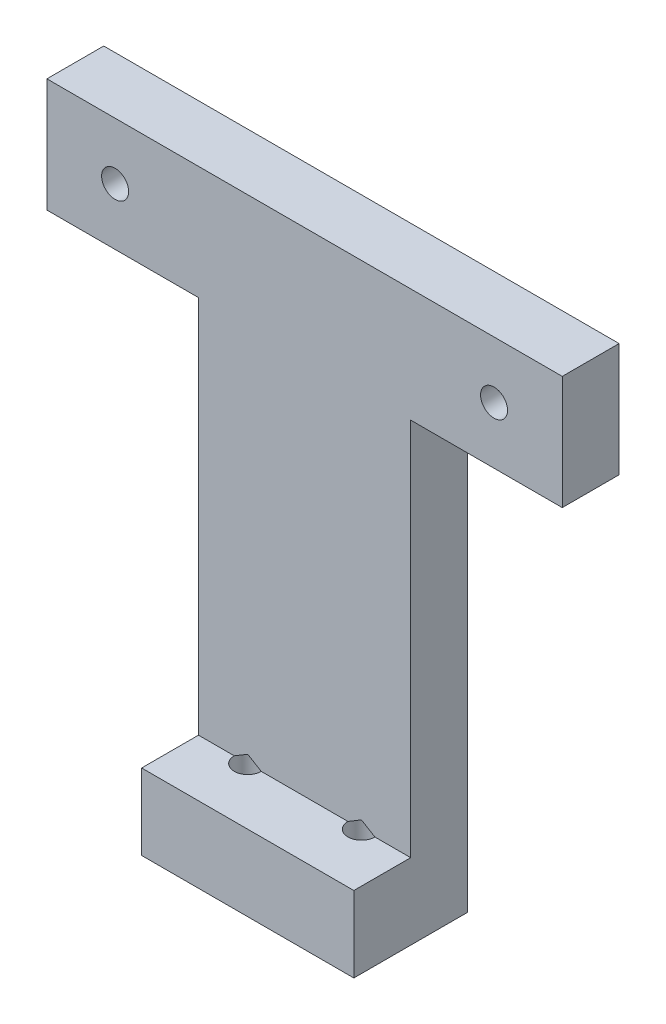
ISO-10303-21;
HEADER;
FILE_DESCRIPTION(('STEP AP214'),'2;1');
FILE_NAME('part.step','',(''),(''),'','','');
FILE_SCHEMA(('AUTOMOTIVE_DESIGN { 1 0 10303 214 1 1 1 1 }'));
ENDSEC;
DATA;
#1=APPLICATION_CONTEXT('core data for automotive mechanical design processes');
#2=APPLICATION_PROTOCOL_DEFINITION('international standard','automotive_design',2000,#1);
#3=PRODUCT_CONTEXT('',#1,'mechanical');
#4=PRODUCT('Part','Part','',(#3));
#5=PRODUCT_RELATED_PRODUCT_CATEGORY('part','',(#4));
#6=PRODUCT_DEFINITION_FORMATION('','',#4);
#7=PRODUCT_DEFINITION_CONTEXT('part definition',#1,'design');
#8=PRODUCT_DEFINITION('design','',#6,#7);
#9=PRODUCT_DEFINITION_SHAPE('','',#8);
#10=(LENGTH_UNIT() NAMED_UNIT(*) SI_UNIT(.MILLI.,.METRE.));
#11=(NAMED_UNIT(*) PLANE_ANGLE_UNIT() SI_UNIT($,.RADIAN.));
#12=(NAMED_UNIT(*) SI_UNIT($,.STERADIAN.) SOLID_ANGLE_UNIT());
#13=UNCERTAINTY_MEASURE_WITH_UNIT(LENGTH_MEASURE(1.E-05),#10,'distance_accuracy_value','');
#14=(GEOMETRIC_REPRESENTATION_CONTEXT(3) GLOBAL_UNCERTAINTY_ASSIGNED_CONTEXT((#13)) GLOBAL_UNIT_ASSIGNED_CONTEXT((#10,
#11,#12)) REPRESENTATION_CONTEXT('',''));
#15=CARTESIAN_POINT('',(0.,0.,0.));
#16=DIRECTION('',(0.,0.,1.));
#17=DIRECTION('',(1.,0.,0.));
#18=AXIS2_PLACEMENT_3D('',#15,#16,#17);
#19=CARTESIAN_POINT('',(-8.88999999999999,47.625,4.7625));
#20=DIRECTION('',(1.,0.,0.));
#21=DIRECTION('',(0.,0.,-1.));
#22=AXIS2_PLACEMENT_3D('',#19,#20,#21);
#23=PLANE('',#22);
#24=DIRECTION('',(0.,0.,1.));
#25=VECTOR('',#24,1.);
#26=CARTESIAN_POINT('',(-8.88999999999999,38.1,-4.7625));
#27=LINE('',#26,#25);
#28=CARTESIAN_POINT('',(-8.88999999999999,38.1,-4.7625));
#29=VERTEX_POINT('',#28);
#30=CARTESIAN_POINT('',(-8.88999999999999,38.1,0.));
#31=VERTEX_POINT('',#30);
#32=EDGE_CURVE('E72',#29,#31,#27,.T.);
#33=ORIENTED_EDGE('',*,*,#32,.F.);
#34=DIRECTION('',(0.,-1.,0.));
#35=VECTOR('',#34,1.);
#36=CARTESIAN_POINT('',(-8.88999999999999,47.625,-4.7625));
#37=LINE('',#36,#35);
#38=CARTESIAN_POINT('',(-8.88999999999999,0.,-4.7625));
#39=VERTEX_POINT('',#38);
#40=EDGE_CURVE('E243',#29,#39,#37,.T.);
#41=ORIENTED_EDGE('',*,*,#40,.T.);
#42=DIRECTION('',(0.,0.,1.));
#43=VECTOR('',#42,1.);
#44=CARTESIAN_POINT('',(-8.88999999999999,0.,4.7625));
#45=LINE('',#44,#43);
#46=CARTESIAN_POINT('',(-8.88999999999999,0.,4.7625));
#47=VERTEX_POINT('',#46);
#48=EDGE_CURVE('E235',#39,#47,#45,.T.);
#49=ORIENTED_EDGE('',*,*,#48,.T.);
#50=DIRECTION('',(0.,-1.,0.));
#51=VECTOR('',#50,1.);
#52=CARTESIAN_POINT('',(-8.88999999999999,47.625,4.7625));
#53=LINE('',#52,#51);
#54=CARTESIAN_POINT('',(-8.88999999999999,6.35,4.7625));
#55=VERTEX_POINT('',#54);
#56=EDGE_CURVE('E241',#55,#47,#53,.T.);
#57=ORIENTED_EDGE('',*,*,#56,.F.);
#58=DIRECTION('',(0.,0.,1.));
#59=VECTOR('',#58,1.);
#60=CARTESIAN_POINT('',(-8.88999999999999,6.35,4.7625));
#61=LINE('',#60,#59);
#62=CARTESIAN_POINT('',(-8.88999999999999,6.35,0.));
#63=VERTEX_POINT('',#62);
#64=EDGE_CURVE('E216',#63,#55,#61,.T.);
#65=ORIENTED_EDGE('',*,*,#64,.F.);
#66=DIRECTION('',(0.,1.,0.));
#67=VECTOR('',#66,1.);
#68=CARTESIAN_POINT('',(-8.88999999999999,-18.4067869616074,0.));
#69=LINE('',#68,#67);
#70=EDGE_CURVE('E219',#63,#31,#69,.T.);
#71=ORIENTED_EDGE('',*,*,#70,.T.);
#72=EDGE_LOOP('',(#33,#41,#49,#57,#65,#71));
#73=FACE_BOUND('',#72,.T.);
#74=ADVANCED_FACE('F49',(#73),#23,.F.);
#75=CARTESIAN_POINT('',(8.89000000000001,47.625,4.7625));
#76=DIRECTION('',(-1.,0.,0.));
#77=DIRECTION('',(0.,0.,1.));
#78=AXIS2_PLACEMENT_3D('',#75,#76,#77);
#79=PLANE('',#78);
#80=DIRECTION('',(0.,-1.,0.));
#81=VECTOR('',#80,1.);
#82=CARTESIAN_POINT('',(8.89000000000001,47.625,-4.7625));
#83=LINE('',#82,#81);
#84=CARTESIAN_POINT('',(8.88999999999999,38.1,-4.7625));
#85=VERTEX_POINT('',#84);
#86=CARTESIAN_POINT('',(8.89000000000001,0.,-4.7625));
#87=VERTEX_POINT('',#86);
#88=EDGE_CURVE('E245',#85,#87,#83,.T.);
#89=ORIENTED_EDGE('',*,*,#88,.F.);
#90=DIRECTION('',(0.,0.,1.));
#91=VECTOR('',#90,1.);
#92=CARTESIAN_POINT('',(8.88999999999999,38.1,-4.7625));
#93=LINE('',#92,#91);
#94=CARTESIAN_POINT('',(8.89000000000001,38.1,0.));
#95=VERTEX_POINT('',#94);
#96=EDGE_CURVE('E168',#85,#95,#93,.T.);
#97=ORIENTED_EDGE('',*,*,#96,.T.);
#98=DIRECTION('',(0.,1.,0.));
#99=VECTOR('',#98,1.);
#100=CARTESIAN_POINT('',(8.89000000000001,-18.4067869616074,0.));
#101=LINE('',#100,#99);
#102=CARTESIAN_POINT('',(8.89000000000001,6.35,0.));
#103=VERTEX_POINT('',#102);
#104=EDGE_CURVE('E227',#103,#95,#101,.T.);
#105=ORIENTED_EDGE('',*,*,#104,.F.);
#106=DIRECTION('',(0.,0.,-1.));
#107=VECTOR('',#106,1.);
#108=CARTESIAN_POINT('',(8.89000000000001,6.35,4.7625));
#109=LINE('',#108,#107);
#110=CARTESIAN_POINT('',(8.89000000000001,6.34999999999999,4.7625));
#111=VERTEX_POINT('',#110);
#112=EDGE_CURVE('E215',#111,#103,#109,.T.);
#113=ORIENTED_EDGE('',*,*,#112,.F.);
#114=DIRECTION('',(0.,-1.,0.));
#115=VECTOR('',#114,1.);
#116=CARTESIAN_POINT('',(8.89000000000001,47.625,4.7625));
#117=LINE('',#116,#115);
#118=CARTESIAN_POINT('',(8.89000000000001,0.,4.7625));
#119=VERTEX_POINT('',#118);
#120=EDGE_CURVE('E158',#111,#119,#117,.T.);
#121=ORIENTED_EDGE('',*,*,#120,.T.);
#122=DIRECTION('',(0.,0.,-1.));
#123=VECTOR('',#122,1.);
#124=CARTESIAN_POINT('',(8.89000000000001,0.,4.7625));
#125=LINE('',#124,#123);
#126=EDGE_CURVE('E218',#119,#87,#125,.T.);
#127=ORIENTED_EDGE('',*,*,#126,.T.);
#128=EDGE_LOOP('',(#89,#97,#105,#113,#121,#127));
#129=FACE_BOUND('',#128,.T.);
#130=ADVANCED_FACE('F51',(#129),#79,.F.);
#131=CARTESIAN_POINT('',(-8.88999999999999,47.625,-4.7625));
#132=DIRECTION('',(0.,0.,1.));
#133=DIRECTION('',(1.,0.,0.));
#134=AXIS2_PLACEMENT_3D('',#131,#132,#133);
#135=PLANE('',#134);
#136=CARTESIAN_POINT('',(-15.875,42.8625,-4.7625));
#137=DIRECTION('',(0.,0.,1.));
#138=DIRECTION('',(1.,0.,0.));
#139=AXIS2_PLACEMENT_3D('',#136,#137,#138);
#140=CIRCLE('',#139,1.1303);
#141=CARTESIAN_POINT('',(-14.7447,42.8625,-4.7625));
#142=VERTEX_POINT('',#141);
#143=EDGE_CURVE('E180',#142,#142,#140,.T.);
#144=ORIENTED_EDGE('',*,*,#143,.T.);
#145=EDGE_LOOP('',(#144));
#146=FACE_BOUND('',#145,.T.);
#147=CARTESIAN_POINT('',(15.875,42.8625,-4.7625));
#148=DIRECTION('',(0.,0.,1.));
#149=DIRECTION('',(1.,0.,0.));
#150=AXIS2_PLACEMENT_3D('',#147,#148,#149);
#151=CIRCLE('',#150,1.1303);
#152=CARTESIAN_POINT('',(17.0053,42.8625,-4.7625));
#153=VERTEX_POINT('',#152);
#154=EDGE_CURVE('E324',#153,#153,#151,.T.);
#155=ORIENTED_EDGE('',*,*,#154,.T.);
#156=EDGE_LOOP('',(#155));
#157=FACE_BOUND('',#156,.T.);
#158=DIRECTION('',(-1.,0.,0.));
#159=VECTOR('',#158,1.);
#160=CARTESIAN_POINT('',(-8.88999999999999,0.,-4.7625));
#161=LINE('',#160,#159);
#162=EDGE_CURVE('E233',#87,#39,#161,.T.);
#163=ORIENTED_EDGE('',*,*,#162,.T.);
#164=ORIENTED_EDGE('',*,*,#40,.F.);
#165=DIRECTION('',(1.,0.,0.));
#166=VECTOR('',#165,1.);
#167=CARTESIAN_POINT('',(-21.59,38.1,-4.7625));
#168=LINE('',#167,#166);
#169=CARTESIAN_POINT('',(-21.59,38.1,-4.7625));
#170=VERTEX_POINT('',#169);
#171=EDGE_CURVE('E195',#170,#29,#168,.T.);
#172=ORIENTED_EDGE('',*,*,#171,.F.);
#173=DIRECTION('',(0.,-1.,0.));
#174=VECTOR('',#173,1.);
#175=CARTESIAN_POINT('',(-21.59,47.625,-4.7625));
#176=LINE('',#175,#174);
#177=CARTESIAN_POINT('',(-21.59,47.625,-4.7625));
#178=VERTEX_POINT('',#177);
#179=EDGE_CURVE('E153',#178,#170,#176,.T.);
#180=ORIENTED_EDGE('',*,*,#179,.F.);
#181=DIRECTION('',(-1.,0.,0.));
#182=VECTOR('',#181,1.);
#183=CARTESIAN_POINT('',(-8.88999999999999,47.625,-4.7625));
#184=LINE('',#183,#182);
#185=CARTESIAN_POINT('',(21.59,47.625,-4.7625));
#186=VERTEX_POINT('',#185);
#187=EDGE_CURVE('E145',#186,#178,#184,.T.);
#188=ORIENTED_EDGE('',*,*,#187,.F.);
#189=DIRECTION('',(0.,-1.,0.));
#190=VECTOR('',#189,1.);
#191=CARTESIAN_POINT('',(21.59,47.625,-4.7625));
#192=LINE('',#191,#190);
#193=CARTESIAN_POINT('',(21.59,38.1,-4.7625));
#194=VERTEX_POINT('',#193);
#195=EDGE_CURVE('E149',#186,#194,#192,.T.);
#196=ORIENTED_EDGE('',*,*,#195,.T.);
#197=DIRECTION('',(-1.,0.,0.));
#198=VECTOR('',#197,1.);
#199=CARTESIAN_POINT('',(21.59,38.1,-4.7625));
#200=LINE('',#199,#198);
#201=EDGE_CURVE('E178',#194,#85,#200,.T.);
#202=ORIENTED_EDGE('',*,*,#201,.T.);
#203=ORIENTED_EDGE('',*,*,#88,.T.);
#204=EDGE_LOOP('',(#163,#164,#172,#180,#188,#196,#202,#203));
#205=FACE_BOUND('',#204,.T.);
#206=ADVANCED_FACE('F148',(#146,#157,#205),#135,.F.);
#207=CARTESIAN_POINT('',(-8.88999999999999,47.625,4.7625));
#208=DIRECTION('',(0.,0.,-1.));
#209=DIRECTION('',(-1.,0.,0.));
#210=AXIS2_PLACEMENT_3D('',#207,#208,#209);
#211=PLANE('',#210);
#212=ORIENTED_EDGE('',*,*,#120,.F.);
#213=DIRECTION('',(1.,0.,0.));
#214=VECTOR('',#213,1.);
#215=CARTESIAN_POINT('',(-8.88999999999999,6.35,4.7625));
#216=LINE('',#215,#214);
#217=EDGE_CURVE('E213',#55,#111,#216,.T.);
#218=ORIENTED_EDGE('',*,*,#217,.F.);
#219=ORIENTED_EDGE('',*,*,#56,.T.);
#220=DIRECTION('',(1.,0.,0.));
#221=VECTOR('',#220,1.);
#222=CARTESIAN_POINT('',(-8.88999999999999,0.,4.7625));
#223=LINE('',#222,#221);
#224=EDGE_CURVE('E159',#47,#119,#223,.T.);
#225=ORIENTED_EDGE('',*,*,#224,.T.);
#226=EDGE_LOOP('',(#212,#218,#219,#225));
#227=FACE_BOUND('',#226,.T.);
#228=ADVANCED_FACE('F280',(#227),#211,.F.);
#229=CARTESIAN_POINT('',(0.,47.625,0.));
#230=DIRECTION('',(0.,-1.,0.));
#231=DIRECTION('',(0.,0.,-1.));
#232=AXIS2_PLACEMENT_3D('',#229,#230,#231);
#233=PLANE('',#232);
#234=ORIENTED_EDGE('',*,*,#187,.T.);
#235=DIRECTION('',(0.,0.,-1.));
#236=VECTOR('',#235,1.);
#237=CARTESIAN_POINT('',(-21.59,47.625,-4.7625));
#238=LINE('',#237,#236);
#239=CARTESIAN_POINT('',(-21.59,47.625,0.));
#240=VERTEX_POINT('',#239);
#241=EDGE_CURVE('E189',#240,#178,#238,.T.);
#242=ORIENTED_EDGE('',*,*,#241,.F.);
#243=DIRECTION('',(-1.,0.,0.));
#244=VECTOR('',#243,1.);
#245=CARTESIAN_POINT('',(-8.88999999999999,47.625,0.));
#246=LINE('',#245,#244);
#247=CARTESIAN_POINT('',(21.59,47.625,0.));
#248=VERTEX_POINT('',#247);
#249=EDGE_CURVE('E171',#248,#240,#246,.T.);
#250=ORIENTED_EDGE('',*,*,#249,.F.);
#251=DIRECTION('',(0.,0.,-1.));
#252=VECTOR('',#251,1.);
#253=CARTESIAN_POINT('',(21.59,47.625,-4.7625));
#254=LINE('',#253,#252);
#255=EDGE_CURVE('E165',#248,#186,#254,.T.);
#256=ORIENTED_EDGE('',*,*,#255,.T.);
#257=EDGE_LOOP('',(#234,#242,#250,#256));
#258=FACE_BOUND('',#257,.T.);
#259=ADVANCED_FACE('F170',(#258),#233,.F.);
#260=CARTESIAN_POINT('',(0.,0.,0.));
#261=DIRECTION('',(0.,-1.,0.));
#262=DIRECTION('',(0.,0.,-1.));
#263=AXIS2_PLACEMENT_3D('',#260,#261,#262);
#264=PLANE('',#263);
#265=CARTESIAN_POINT('',(4.7625,0.,0.));
#266=DIRECTION('',(0.,-1.,0.));
#267=DIRECTION('',(0.,0.,-1.));
#268=AXIS2_PLACEMENT_3D('',#265,#266,#267);
#269=CIRCLE('',#268,1.13029999999999);
#270=CARTESIAN_POINT('',(4.7625,0.,-1.13029999999999));
#271=VERTEX_POINT('',#270);
#272=EDGE_CURVE('E198',#271,#271,#269,.T.);
#273=ORIENTED_EDGE('',*,*,#272,.F.);
#274=EDGE_LOOP('',(#273));
#275=FACE_BOUND('',#274,.T.);
#276=CARTESIAN_POINT('',(-4.7625,0.,0.));
#277=DIRECTION('',(0.,-1.,0.));
#278=DIRECTION('',(0.,0.,-1.));
#279=AXIS2_PLACEMENT_3D('',#276,#277,#278);
#280=CIRCLE('',#279,1.13029999999999);
#281=CARTESIAN_POINT('',(-4.7625,0.,-1.13029999999999));
#282=VERTEX_POINT('',#281);
#283=EDGE_CURVE('E205',#282,#282,#280,.T.);
#284=ORIENTED_EDGE('',*,*,#283,.F.);
#285=EDGE_LOOP('',(#284));
#286=FACE_BOUND('',#285,.T.);
#287=ORIENTED_EDGE('',*,*,#126,.F.);
#288=ORIENTED_EDGE('',*,*,#224,.F.);
#289=ORIENTED_EDGE('',*,*,#48,.F.);
#290=ORIENTED_EDGE('',*,*,#162,.F.);
#291=EDGE_LOOP('',(#287,#288,#289,#290));
#292=FACE_BOUND('',#291,.T.);
#293=ADVANCED_FACE('F276',(#275,#286,#292),#264,.T.);
#294=CARTESIAN_POINT('',(0.,6.35,0.));
#295=DIRECTION('',(0.,-1.,0.));
#296=DIRECTION('',(0.,0.,-1.));
#297=AXIS2_PLACEMENT_3D('',#294,#295,#296);
#298=PLANE('',#297);
#299=DIRECTION('',(-1.,0.,0.));
#300=VECTOR('',#299,1.);
#301=CARTESIAN_POINT('',(-8.88999999999999,6.35,0.));
#302=LINE('',#301,#300);
#303=CARTESIAN_POINT('',(5.8928,6.35,0.));
#304=VERTEX_POINT('',#303);
#305=EDGE_CURVE('E220',#103,#304,#302,.T.);
#306=ORIENTED_EDGE('',*,*,#305,.T.);
#307=CARTESIAN_POINT('',(4.7625,6.35,0.));
#308=DIRECTION('',(0.,-1.,0.));
#309=DIRECTION('',(0.,0.,-1.));
#310=AXIS2_PLACEMENT_3D('',#307,#308,#309);
#311=CIRCLE('',#310,1.1303);
#312=CARTESIAN_POINT('',(3.6322,6.35,0.));
#313=VERTEX_POINT('',#312);
#314=EDGE_CURVE('E202',#304,#313,#311,.T.);
#315=ORIENTED_EDGE('',*,*,#314,.T.);
#316=CARTESIAN_POINT('',(-3.6322,6.35,0.));
#317=VERTEX_POINT('',#316);
#318=EDGE_CURVE('E223',#313,#317,#302,.T.);
#319=ORIENTED_EDGE('',*,*,#318,.T.);
#320=CARTESIAN_POINT('',(-4.7625,6.35,0.));
#321=DIRECTION('',(0.,-1.,0.));
#322=DIRECTION('',(0.,0.,-1.));
#323=AXIS2_PLACEMENT_3D('',#320,#321,#322);
#324=CIRCLE('',#323,1.1303);
#325=CARTESIAN_POINT('',(-5.8928,6.35,0.));
#326=VERTEX_POINT('',#325);
#327=EDGE_CURVE('E209',#317,#326,#324,.T.);
#328=ORIENTED_EDGE('',*,*,#327,.T.);
#329=EDGE_CURVE('E224',#326,#63,#302,.T.);
#330=ORIENTED_EDGE('',*,*,#329,.T.);
#331=ORIENTED_EDGE('',*,*,#64,.T.);
#332=ORIENTED_EDGE('',*,*,#217,.T.);
#333=ORIENTED_EDGE('',*,*,#112,.T.);
#334=EDGE_LOOP('',(#306,#315,#319,#328,#330,#331,#332,#333));
#335=FACE_BOUND('',#334,.T.);
#336=ADVANCED_FACE('F264',(#335),#298,.F.);
#337=CARTESIAN_POINT('',(-8.88999999999999,-18.4067869616074,0.));
#338=DIRECTION('',(0.,0.,-1.));
#339=DIRECTION('',(-1.,0.,0.));
#340=AXIS2_PLACEMENT_3D('',#337,#338,#339);
#341=PLANE('',#340);
#342=CARTESIAN_POINT('',(-15.875,42.8625,0.));
#343=DIRECTION('',(0.,0.,1.));
#344=DIRECTION('',(1.,0.,0.));
#345=AXIS2_PLACEMENT_3D('',#342,#343,#344);
#346=CIRCLE('',#345,1.1303);
#347=CARTESIAN_POINT('',(-14.7447,42.8625,0.));
#348=VERTEX_POINT('',#347);
#349=EDGE_CURVE('E328',#348,#348,#346,.T.);
#350=ORIENTED_EDGE('',*,*,#349,.F.);
#351=EDGE_LOOP('',(#350));
#352=FACE_BOUND('',#351,.T.);
#353=CARTESIAN_POINT('',(15.875,42.8625,0.));
#354=DIRECTION('',(0.,0.,1.));
#355=DIRECTION('',(1.,0.,0.));
#356=AXIS2_PLACEMENT_3D('',#353,#354,#355);
#357=CIRCLE('',#356,1.1303);
#358=CARTESIAN_POINT('',(17.0053,42.8625,0.));
#359=VERTEX_POINT('',#358);
#360=EDGE_CURVE('E326',#359,#359,#357,.T.);
#361=ORIENTED_EDGE('',*,*,#360,.F.);
#362=EDGE_LOOP('',(#361));
#363=FACE_BOUND('',#362,.T.);
#364=DIRECTION('',(0.857167300702112,0.515038074910055,0.));
#365=VECTOR('',#364,1.);
#366=CARTESIAN_POINT('',(4.7625,7.02915275768685,0.));
#367=LINE('',#366,#365);
#368=CARTESIAN_POINT('',(4.7625,7.02915275768685,0.));
#369=VERTEX_POINT('',#368);
#370=EDGE_CURVE('E57',#313,#369,#367,.T.);
#371=ORIENTED_EDGE('',*,*,#370,.T.);
#372=DIRECTION('',(0.857167300702112,-0.515038074910055,0.));
#373=VECTOR('',#372,1.);
#374=CARTESIAN_POINT('',(4.7625,7.02915275768685,0.));
#375=LINE('',#374,#373);
#376=EDGE_CURVE('E12',#369,#304,#375,.T.);
#377=ORIENTED_EDGE('',*,*,#376,.T.);
#378=ORIENTED_EDGE('',*,*,#305,.F.);
#379=ORIENTED_EDGE('',*,*,#104,.T.);
#380=DIRECTION('',(-1.,0.,0.));
#381=VECTOR('',#380,1.);
#382=CARTESIAN_POINT('',(21.59,38.1,0.));
#383=LINE('',#382,#381);
#384=CARTESIAN_POINT('',(21.59,38.1,0.));
#385=VERTEX_POINT('',#384);
#386=EDGE_CURVE('E64',#385,#95,#383,.T.);
#387=ORIENTED_EDGE('',*,*,#386,.F.);
#388=DIRECTION('',(0.,1.,0.));
#389=VECTOR('',#388,1.);
#390=CARTESIAN_POINT('',(21.59,47.625,0.));
#391=LINE('',#390,#389);
#392=EDGE_CURVE('E172',#385,#248,#391,.T.);
#393=ORIENTED_EDGE('',*,*,#392,.T.);
#394=ORIENTED_EDGE('',*,*,#249,.T.);
#395=DIRECTION('',(0.,1.,0.));
#396=VECTOR('',#395,1.);
#397=CARTESIAN_POINT('',(-21.59,47.625,0.));
#398=LINE('',#397,#396);
#399=CARTESIAN_POINT('',(-21.59,38.1,0.));
#400=VERTEX_POINT('',#399);
#401=EDGE_CURVE('E186',#400,#240,#398,.T.);
#402=ORIENTED_EDGE('',*,*,#401,.F.);
#403=DIRECTION('',(1.,0.,0.));
#404=VECTOR('',#403,1.);
#405=CARTESIAN_POINT('',(-21.59,38.1,0.));
#406=LINE('',#405,#404);
#407=EDGE_CURVE('E191',#400,#31,#406,.T.);
#408=ORIENTED_EDGE('',*,*,#407,.T.);
#409=ORIENTED_EDGE('',*,*,#70,.F.);
#410=ORIENTED_EDGE('',*,*,#329,.F.);
#411=DIRECTION('',(0.857167300702112,0.515038074910055,0.));
#412=VECTOR('',#411,1.);
#413=CARTESIAN_POINT('',(-4.7625,7.02915275768685,0.));
#414=LINE('',#413,#412);
#415=CARTESIAN_POINT('',(-4.7625,7.02915275768685,0.));
#416=VERTEX_POINT('',#415);
#417=EDGE_CURVE('E247',#326,#416,#414,.T.);
#418=ORIENTED_EDGE('',*,*,#417,.T.);
#419=DIRECTION('',(0.857167300702112,-0.515038074910055,0.));
#420=VECTOR('',#419,1.);
#421=CARTESIAN_POINT('',(-4.7625,7.02915275768685,0.));
#422=LINE('',#421,#420);
#423=EDGE_CURVE('E250',#416,#317,#422,.T.);
#424=ORIENTED_EDGE('',*,*,#423,.T.);
#425=ORIENTED_EDGE('',*,*,#318,.F.);
#426=EDGE_LOOP('',(#371,#377,#378,#379,#387,#393,#394,#402,#408,#409,#410,#418,#424,#425));
#427=FACE_BOUND('',#426,.T.);
#428=ADVANCED_FACE('F255',(#352,#363,#427),#341,.F.);
#429=CARTESIAN_POINT('',(-4.7625,6.35,0.));
#430=DIRECTION('',(0.,-1.,0.));
#431=DIRECTION('',(0.,0.,-1.));
#432=AXIS2_PLACEMENT_3D('',#429,#430,#431);
#433=CONICAL_SURFACE('',#432,1.1303,1.02974425867665);
#434=ORIENTED_EDGE('',*,*,#417,.F.);
#435=EDGE_CURVE('E208',#326,#317,#324,.T.);
#436=ORIENTED_EDGE('',*,*,#435,.T.);
#437=ORIENTED_EDGE('',*,*,#423,.F.);
#438=EDGE_LOOP('',(#434,#436,#437));
#439=FACE_BOUND('',#438,.T.);
#440=ADVANCED_FACE('F297',(#439),#433,.F.);
#441=CARTESIAN_POINT('',(-4.7625,0.,0.));
#442=DIRECTION('',(0.,-1.,0.));
#443=DIRECTION('',(0.,0.,-1.));
#444=AXIS2_PLACEMENT_3D('',#441,#442,#443);
#445=CYLINDRICAL_SURFACE('',#444,1.13029999999999);
#446=ORIENTED_EDGE('',*,*,#327,.F.);
#447=ORIENTED_EDGE('',*,*,#435,.F.);
#448=EDGE_LOOP('',(#446,#447));
#449=FACE_BOUND('',#448,.T.);
#450=ORIENTED_EDGE('',*,*,#283,.T.);
#451=EDGE_LOOP('',(#450));
#452=FACE_BOUND('',#451,.T.);
#453=ADVANCED_FACE('F294',(#449,#452),#445,.F.);
#454=CARTESIAN_POINT('',(4.7625,6.35,0.));
#455=DIRECTION('',(0.,-1.,0.));
#456=DIRECTION('',(0.,0.,-1.));
#457=AXIS2_PLACEMENT_3D('',#454,#455,#456);
#458=CONICAL_SURFACE('',#457,1.1303,1.02974425867665);
#459=ORIENTED_EDGE('',*,*,#370,.F.);
#460=EDGE_CURVE('E201',#313,#304,#311,.T.);
#461=ORIENTED_EDGE('',*,*,#460,.T.);
#462=ORIENTED_EDGE('',*,*,#376,.F.);
#463=EDGE_LOOP('',(#459,#461,#462));
#464=FACE_BOUND('',#463,.T.);
#465=ADVANCED_FACE('F258',(#464),#458,.F.);
#466=CARTESIAN_POINT('',(4.7625,0.,0.));
#467=DIRECTION('',(0.,-1.,0.));
#468=DIRECTION('',(0.,0.,-1.));
#469=AXIS2_PLACEMENT_3D('',#466,#467,#468);
#470=CYLINDRICAL_SURFACE('',#469,1.13029999999999);
#471=ORIENTED_EDGE('',*,*,#314,.F.);
#472=ORIENTED_EDGE('',*,*,#460,.F.);
#473=EDGE_LOOP('',(#471,#472));
#474=FACE_BOUND('',#473,.T.);
#475=ORIENTED_EDGE('',*,*,#272,.T.);
#476=EDGE_LOOP('',(#475));
#477=FACE_BOUND('',#476,.T.);
#478=ADVANCED_FACE('F261',(#474,#477),#470,.F.);
#479=CARTESIAN_POINT('',(-21.59,38.1,-4.7625));
#480=DIRECTION('',(0.,1.,0.));
#481=DIRECTION('',(0.,0.,1.));
#482=AXIS2_PLACEMENT_3D('',#479,#480,#481);
#483=PLANE('',#482);
#484=ORIENTED_EDGE('',*,*,#32,.T.);
#485=ORIENTED_EDGE('',*,*,#407,.F.);
#486=DIRECTION('',(0.,0.,1.));
#487=VECTOR('',#486,1.);
#488=CARTESIAN_POINT('',(-21.59,38.1,-4.7625));
#489=LINE('',#488,#487);
#490=EDGE_CURVE('E184',#170,#400,#489,.T.);
#491=ORIENTED_EDGE('',*,*,#490,.F.);
#492=ORIENTED_EDGE('',*,*,#171,.T.);
#493=EDGE_LOOP('',(#484,#485,#491,#492));
#494=FACE_BOUND('',#493,.T.);
#495=ADVANCED_FACE('F284',(#494),#483,.F.);
#496=CARTESIAN_POINT('',(-21.59,0.,0.));
#497=DIRECTION('',(-1.,0.,0.));
#498=DIRECTION('',(0.,0.,1.));
#499=AXIS2_PLACEMENT_3D('',#496,#497,#498);
#500=PLANE('',#499);
#501=ORIENTED_EDGE('',*,*,#179,.T.);
#502=ORIENTED_EDGE('',*,*,#490,.T.);
#503=ORIENTED_EDGE('',*,*,#401,.T.);
#504=ORIENTED_EDGE('',*,*,#241,.T.);
#505=EDGE_LOOP('',(#501,#502,#503,#504));
#506=FACE_BOUND('',#505,.T.);
#507=ADVANCED_FACE('F288',(#506),#500,.T.);
#508=CARTESIAN_POINT('',(21.59,38.1,-4.7625));
#509=DIRECTION('',(0.,-1.,0.));
#510=DIRECTION('',(0.,0.,-1.));
#511=AXIS2_PLACEMENT_3D('',#508,#509,#510);
#512=PLANE('',#511);
#513=ORIENTED_EDGE('',*,*,#96,.F.);
#514=ORIENTED_EDGE('',*,*,#201,.F.);
#515=DIRECTION('',(0.,0.,1.));
#516=VECTOR('',#515,1.);
#517=CARTESIAN_POINT('',(21.59,38.1,-4.7625));
#518=LINE('',#517,#516);
#519=EDGE_CURVE('E167',#194,#385,#518,.T.);
#520=ORIENTED_EDGE('',*,*,#519,.T.);
#521=ORIENTED_EDGE('',*,*,#386,.T.);
#522=EDGE_LOOP('',(#513,#514,#520,#521));
#523=FACE_BOUND('',#522,.T.);
#524=ADVANCED_FACE('F271',(#523),#512,.T.);
#525=CARTESIAN_POINT('',(21.59,0.,0.));
#526=DIRECTION('',(1.,0.,0.));
#527=DIRECTION('',(0.,0.,1.));
#528=AXIS2_PLACEMENT_3D('',#525,#526,#527);
#529=PLANE('',#528);
#530=ORIENTED_EDGE('',*,*,#195,.F.);
#531=ORIENTED_EDGE('',*,*,#255,.F.);
#532=ORIENTED_EDGE('',*,*,#392,.F.);
#533=ORIENTED_EDGE('',*,*,#519,.F.);
#534=EDGE_LOOP('',(#530,#531,#532,#533));
#535=FACE_BOUND('',#534,.T.);
#536=ADVANCED_FACE('F163',(#535),#529,.T.);
#537=CARTESIAN_POINT('',(15.875,42.8625,-4.7625));
#538=DIRECTION('',(0.,0.,1.));
#539=DIRECTION('',(1.,0.,0.));
#540=AXIS2_PLACEMENT_3D('',#537,#538,#539);
#541=CYLINDRICAL_SURFACE('',#540,1.1303);
#542=ORIENTED_EDGE('',*,*,#154,.F.);
#543=EDGE_LOOP('',(#542));
#544=FACE_BOUND('',#543,.T.);
#545=ORIENTED_EDGE('',*,*,#360,.T.);
#546=EDGE_LOOP('',(#545));
#547=FACE_BOUND('',#546,.T.);
#548=ADVANCED_FACE('F339',(#544,#547),#541,.F.);
#549=CARTESIAN_POINT('',(-15.875,42.8625,-4.7625));
#550=DIRECTION('',(0.,0.,1.));
#551=DIRECTION('',(1.,0.,0.));
#552=AXIS2_PLACEMENT_3D('',#549,#550,#551);
#553=CYLINDRICAL_SURFACE('',#552,1.1303);
#554=ORIENTED_EDGE('',*,*,#143,.F.);
#555=EDGE_LOOP('',(#554));
#556=FACE_BOUND('',#555,.T.);
#557=ORIENTED_EDGE('',*,*,#349,.T.);
#558=EDGE_LOOP('',(#557));
#559=FACE_BOUND('',#558,.T.);
#560=ADVANCED_FACE('F335',(#556,#559),#553,.F.);
#561=CLOSED_SHELL('',(#74,#130,#206,#228,#259,#293,#336,#428,#440,#453,#465,#478,#495,#507,#524,
#536,#548,#560));
#562=MANIFOLD_SOLID_BREP('B2',#561);
#563=ADVANCED_BREP_SHAPE_REPRESENTATION('',(#18,#562),#14);
#564=SHAPE_DEFINITION_REPRESENTATION(#9,#563);
ENDSEC;
END-ISO-10303-21;
